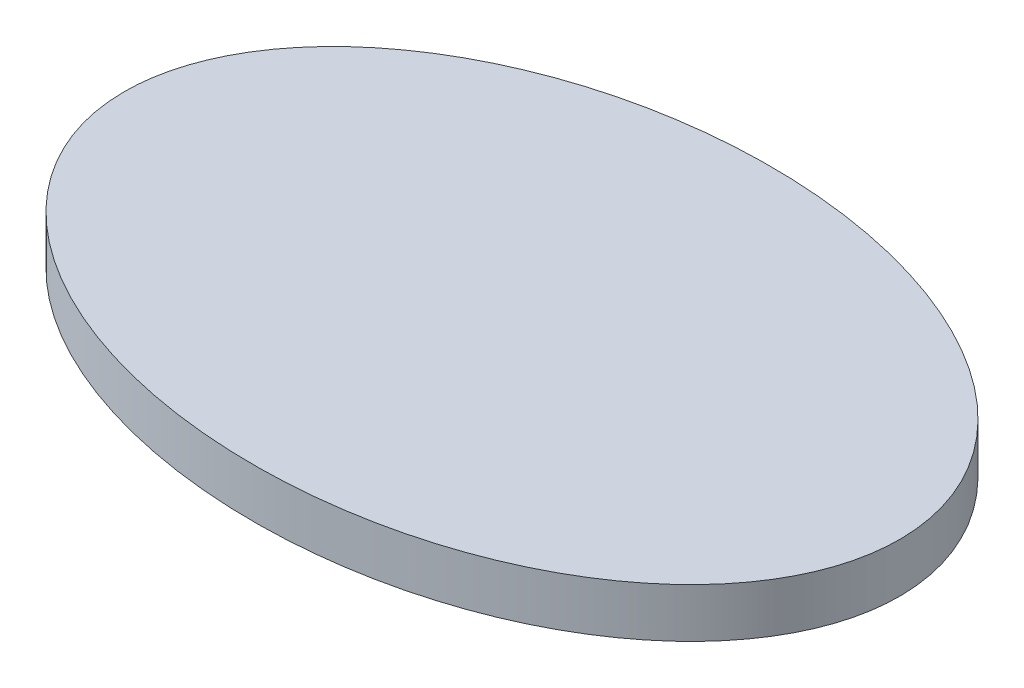
ISO-10303-21;
HEADER;
FILE_DESCRIPTION(('STEP AP214'),'2;1');
FILE_NAME('part.step','',(''),(''),'','','');
FILE_SCHEMA(('AUTOMOTIVE_DESIGN { 1 0 10303 214 1 1 1 1 }'));
ENDSEC;
DATA;
#1=APPLICATION_CONTEXT('core data for automotive mechanical design processes');
#2=APPLICATION_PROTOCOL_DEFINITION('international standard','automotive_design',2000,#1);
#3=PRODUCT_CONTEXT('',#1,'mechanical');
#4=PRODUCT('Part','Part','',(#3));
#5=PRODUCT_RELATED_PRODUCT_CATEGORY('part','',(#4));
#6=PRODUCT_DEFINITION_FORMATION('','',#4);
#7=PRODUCT_DEFINITION_CONTEXT('part definition',#1,'design');
#8=PRODUCT_DEFINITION('design','',#6,#7);
#9=PRODUCT_DEFINITION_SHAPE('','',#8);
#10=(LENGTH_UNIT() NAMED_UNIT(*) SI_UNIT(.MILLI.,.METRE.));
#11=(NAMED_UNIT(*) PLANE_ANGLE_UNIT() SI_UNIT($,.RADIAN.));
#12=(NAMED_UNIT(*) SI_UNIT($,.STERADIAN.) SOLID_ANGLE_UNIT());
#13=UNCERTAINTY_MEASURE_WITH_UNIT(LENGTH_MEASURE(1.E-05),#10,'distance_accuracy_value','');
#14=(GEOMETRIC_REPRESENTATION_CONTEXT(3) GLOBAL_UNCERTAINTY_ASSIGNED_CONTEXT((#13)) GLOBAL_UNIT_ASSIGNED_CONTEXT((#10,
#11,#12)) REPRESENTATION_CONTEXT('',''));
#15=CARTESIAN_POINT('',(0.,0.,0.));
#16=DIRECTION('',(0.,0.,1.));
#17=DIRECTION('',(1.,0.,0.));
#18=AXIS2_PLACEMENT_3D('',#15,#16,#17);
#19=CARTESIAN_POINT('',(0.,189.802563773199,0.));
#20=DIRECTION('',(0.,1.,0.));
#21=DIRECTION('',(-1.,0.,0.));
#22=AXIS2_PLACEMENT_3D('',#19,#20,#21);
#23=ELLIPSE('',#22,75.,50.);
#24=DIRECTION('',(0.,-1.,0.));
#25=VECTOR('',#24,1.);
#26=SURFACE_OF_LINEAR_EXTRUSION('',#23,#25);
#27=CARTESIAN_POINT('',(0.,0.,0.));
#28=DIRECTION('',(0.,1.,0.));
#29=DIRECTION('',(-1.,0.,0.));
#30=AXIS2_PLACEMENT_3D('',#27,#28,#29);
#31=ELLIPSE('',#30,75.,50.);
#32=CARTESIAN_POINT('',(-75.,0.,0.));
#33=VERTEX_POINT('',#32);
#34=EDGE_CURVE('E39',#33,#33,#31,.T.);
#35=ORIENTED_EDGE('',*,*,#34,.T.);
#36=EDGE_LOOP('',(#35));
#37=FACE_BOUND('',#36,.T.);
#38=CARTESIAN_POINT('',(0.,9.52500000000001,0.));
#39=DIRECTION('',(0.,1.,0.));
#40=DIRECTION('',(-1.,0.,0.));
#41=AXIS2_PLACEMENT_3D('',#38,#39,#40);
#42=ELLIPSE('',#41,75.,50.);
#43=CARTESIAN_POINT('',(-75.,9.52500000000001,0.));
#44=VERTEX_POINT('',#43);
#45=EDGE_CURVE('E10',#44,#44,#42,.T.);
#46=ORIENTED_EDGE('',*,*,#45,.F.);
#47=EDGE_LOOP('',(#46));
#48=FACE_BOUND('',#47,.T.);
#49=ADVANCED_FACE('F31',(#37,#48),#26,.F.);
#50=CARTESIAN_POINT('',(0.,0.,0.));
#51=DIRECTION('',(0.,1.,0.));
#52=DIRECTION('',(0.,0.,1.));
#53=AXIS2_PLACEMENT_3D('',#50,#51,#52);
#54=PLANE('',#53);
#55=ORIENTED_EDGE('',*,*,#34,.F.);
#56=EDGE_LOOP('',(#55));
#57=FACE_BOUND('',#56,.T.);
#58=ADVANCED_FACE('F48',(#57),#54,.F.);
#59=CARTESIAN_POINT('',(0.,9.525,0.));
#60=DIRECTION('',(0.,1.,0.));
#61=DIRECTION('',(0.,0.,1.));
#62=AXIS2_PLACEMENT_3D('',#59,#60,#61);
#63=PLANE('',#62);
#64=ORIENTED_EDGE('',*,*,#45,.T.);
#65=EDGE_LOOP('',(#64));
#66=FACE_BOUND('',#65,.T.);
#67=ADVANCED_FACE('F33',(#66),#63,.T.);
#68=CLOSED_SHELL('',(#49,#58,#67));
#69=MANIFOLD_SOLID_BREP('B2',#68);
#70=ADVANCED_BREP_SHAPE_REPRESENTATION('',(#18,#69),#14);
#71=SHAPE_DEFINITION_REPRESENTATION(#9,#70);
ENDSEC;
END-ISO-10303-21;
